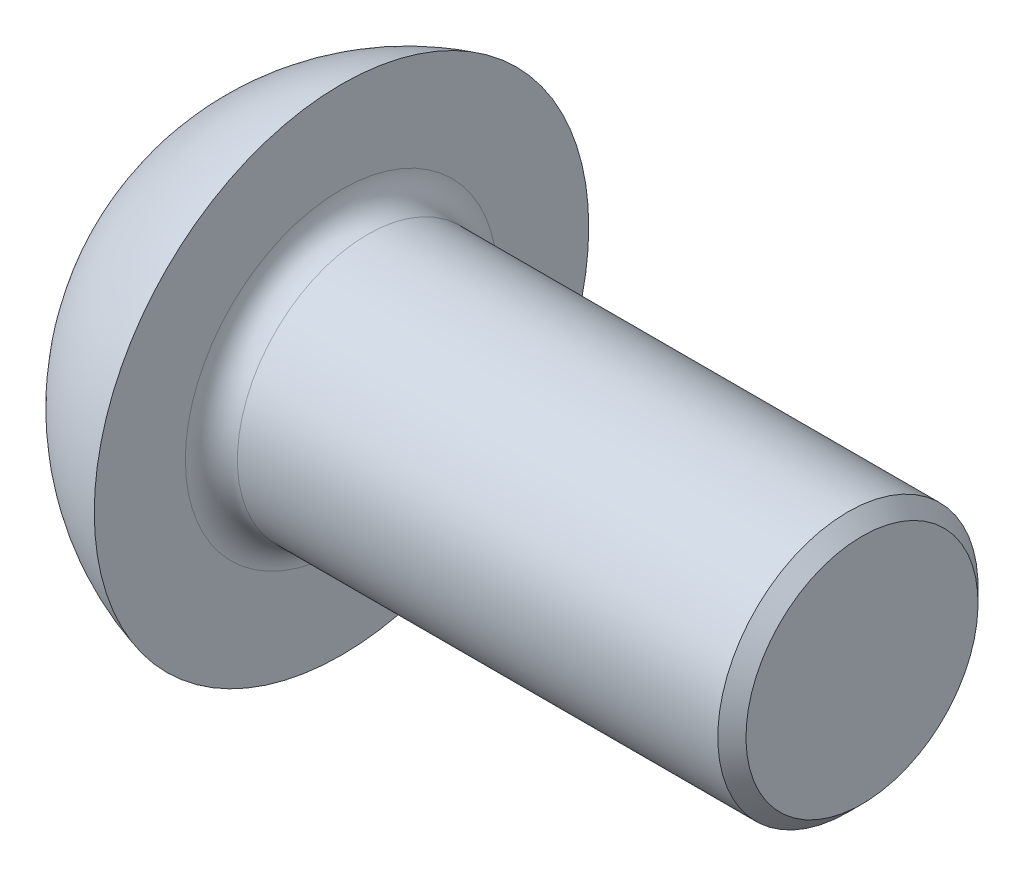
ISO-10303-21;
HEADER;
FILE_DESCRIPTION(('STEP AP214'),'2;1');
FILE_NAME('part.step','',(''),(''),'','','');
FILE_SCHEMA(('AUTOMOTIVE_DESIGN { 1 0 10303 214 1 1 1 1 }'));
ENDSEC;
DATA;
#1=APPLICATION_CONTEXT('core data for automotive mechanical design processes');
#2=APPLICATION_PROTOCOL_DEFINITION('international standard','automotive_design',2000,#1);
#3=PRODUCT_CONTEXT('',#1,'mechanical');
#4=PRODUCT('Part','Part','',(#3));
#5=PRODUCT_RELATED_PRODUCT_CATEGORY('part','',(#4));
#6=PRODUCT_DEFINITION_FORMATION('','',#4);
#7=PRODUCT_DEFINITION_CONTEXT('part definition',#1,'design');
#8=PRODUCT_DEFINITION('design','',#6,#7);
#9=PRODUCT_DEFINITION_SHAPE('','',#8);
#10=(LENGTH_UNIT() NAMED_UNIT(*) SI_UNIT(.MILLI.,.METRE.));
#11=(NAMED_UNIT(*) PLANE_ANGLE_UNIT() SI_UNIT($,.RADIAN.));
#12=(NAMED_UNIT(*) SI_UNIT($,.STERADIAN.) SOLID_ANGLE_UNIT());
#13=UNCERTAINTY_MEASURE_WITH_UNIT(LENGTH_MEASURE(1.E-05),#10,'distance_accuracy_value','');
#14=(GEOMETRIC_REPRESENTATION_CONTEXT(3) GLOBAL_UNCERTAINTY_ASSIGNED_CONTEXT((#13)) GLOBAL_UNIT_ASSIGNED_CONTEXT((#10,
#11,#12)) REPRESENTATION_CONTEXT('',''));
#15=CARTESIAN_POINT('',(0.,0.,0.));
#16=DIRECTION('',(0.,0.,1.));
#17=DIRECTION('',(1.,0.,0.));
#18=AXIS2_PLACEMENT_3D('',#15,#16,#17);
#19=CARTESIAN_POINT('',(-1.651,-0.500129670685513,-0.86625));
#20=DIRECTION('',(0.,-0.5,-0.866025403784439));
#21=DIRECTION('',(0.,0.866025403784439,-0.5));
#22=AXIS2_PLACEMENT_3D('',#19,#20,#21);
#23=PLANE('',#22);
#24=DIRECTION('',(0.,0.866025403784439,-0.5));
#25=VECTOR('',#24,1.);
#26=CARTESIAN_POINT('',(-1.65,-0.18193505277095,-1.04995974830766));
#27=LINE('',#26,#25);
#28=CARTESIAN_POINT('',(-1.65,-1.00025934137103,-0.5775));
#29=VERTEX_POINT('',#28);
#30=CARTESIAN_POINT('',(-1.65,0.,-1.155));
#31=VERTEX_POINT('',#30);
#32=EDGE_CURVE('E34',#29,#31,#27,.T.);
#33=ORIENTED_EDGE('',*,*,#32,.F.);
#34=DIRECTION('',(-1.,0.,0.));
#35=VECTOR('',#34,1.);
#36=CARTESIAN_POINT('',(-1.131,-1.00025934137103,-0.5775));
#37=LINE('',#36,#35);
#38=CARTESIAN_POINT('',(-0.611,-1.00025934137103,-0.5775));
#39=VERTEX_POINT('',#38);
#40=EDGE_CURVE('E101',#39,#29,#37,.T.);
#41=ORIENTED_EDGE('',*,*,#40,.F.);
#42=CARTESIAN_POINT('',(-0.611,0.,-1.155));
#43=CARTESIAN_POINT('',(-0.444290109771495,-0.500129670685514,-0.866249999999999));
#44=CARTESIAN_POINT('',(-0.611,-1.00025934137103,-0.5775));
#45=(BOUNDED_CURVE() B_SPLINE_CURVE(2,(#42,#43,#44),.UNSPECIFIED.,.F.,
.F.) B_SPLINE_CURVE_WITH_KNOTS((3,3),(0.,1.16873916190792),
.UNSPECIFIED.) CURVE() GEOMETRIC_REPRESENTATION_ITEM() RATIONAL_B_SPLINE_CURVE((1.,
1.15470053837925,1.)) REPRESENTATION_ITEM(''));
#46=CARTESIAN_POINT('',(-0.611,0.,-1.155));
#47=VERTEX_POINT('',#46);
#48=EDGE_CURVE('E150',#47,#39,#45,.T.);
#49=ORIENTED_EDGE('',*,*,#48,.F.);
#50=DIRECTION('',(-1.,0.,0.));
#51=VECTOR('',#50,1.);
#52=CARTESIAN_POINT('',(-1.131,0.,-1.155));
#53=LINE('',#52,#51);
#54=EDGE_CURVE('E11',#47,#31,#53,.T.);
#55=ORIENTED_EDGE('',*,*,#54,.T.);
#56=EDGE_LOOP('',(#33,#41,#49,#55));
#57=FACE_BOUND('',#56,.T.);
#58=ADVANCED_FACE('F16',(#57),#23,.F.);
#59=CARTESIAN_POINT('',(-1.651,0.500129670685513,-0.86625));
#60=DIRECTION('',(0.,0.5,-0.866025403784439));
#61=DIRECTION('',(0.,0.866025403784439,0.5));
#62=AXIS2_PLACEMENT_3D('',#59,#60,#61);
#63=PLANE('',#62);
#64=DIRECTION('',(0.,0.866025403784439,0.5));
#65=VECTOR('',#64,1.);
#66=CARTESIAN_POINT('',(-1.65,0.818324288600077,-0.682540251692337));
#67=LINE('',#66,#65);
#68=CARTESIAN_POINT('',(-1.65,1.00025934137103,-0.5775));
#69=VERTEX_POINT('',#68);
#70=EDGE_CURVE('E137',#31,#69,#67,.T.);
#71=ORIENTED_EDGE('',*,*,#70,.F.);
#72=ORIENTED_EDGE('',*,*,#54,.F.);
#73=CARTESIAN_POINT('',(-0.611,1.00025934137103,-0.5775));
#74=CARTESIAN_POINT('',(-0.444290109771496,0.500129670685513,-0.866250000000001));
#75=CARTESIAN_POINT('',(-0.611,0.,-1.155));
#76=(BOUNDED_CURVE() B_SPLINE_CURVE(2,(#73,#74,#75),.UNSPECIFIED.,.F.,
.F.) B_SPLINE_CURVE_WITH_KNOTS((3,3),(0.,1.16873916190792),
.UNSPECIFIED.) CURVE() GEOMETRIC_REPRESENTATION_ITEM() RATIONAL_B_SPLINE_CURVE((1.,
1.15470053837925,1.)) REPRESENTATION_ITEM(''));
#77=CARTESIAN_POINT('',(-0.611,1.00025934137103,-0.5775));
#78=VERTEX_POINT('',#77);
#79=EDGE_CURVE('E142',#78,#47,#76,.T.);
#80=ORIENTED_EDGE('',*,*,#79,.F.);
#81=DIRECTION('',(-1.,0.,0.));
#82=VECTOR('',#81,1.);
#83=CARTESIAN_POINT('',(-1.131,1.00025934137103,-0.5775));
#84=LINE('',#83,#82);
#85=EDGE_CURVE('E26',#78,#69,#84,.T.);
#86=ORIENTED_EDGE('',*,*,#85,.T.);
#87=EDGE_LOOP('',(#71,#72,#80,#86));
#88=FACE_BOUND('',#87,.T.);
#89=ADVANCED_FACE('F185',(#88),#63,.F.);
#90=CARTESIAN_POINT('',(-1.651,1.00025934137103,0.));
#91=DIRECTION('',(0.,1.,0.));
#92=DIRECTION('',(0.,0.,1.));
#93=AXIS2_PLACEMENT_3D('',#90,#91,#92);
#94=PLANE('',#93);
#95=DIRECTION('',(0.,0.,1.));
#96=VECTOR('',#95,1.);
#97=CARTESIAN_POINT('',(-1.65,1.00025934137103,0.));
#98=LINE('',#97,#96);
#99=CARTESIAN_POINT('',(-1.65,1.00025934137103,0.5775));
#100=VERTEX_POINT('',#99);
#101=EDGE_CURVE('E155',#69,#100,#98,.T.);
#102=ORIENTED_EDGE('',*,*,#101,.F.);
#103=ORIENTED_EDGE('',*,*,#85,.F.);
#104=CARTESIAN_POINT('',(-0.611,1.00025934137103,0.5775));
#105=CARTESIAN_POINT('',(-0.444290109771495,1.00025934137103,0.));
#106=CARTESIAN_POINT('',(-0.611,1.00025934137103,-0.5775));
#107=(BOUNDED_CURVE() B_SPLINE_CURVE(2,(#104,#105,#106),.UNSPECIFIED.,.F.,
.F.) B_SPLINE_CURVE_WITH_KNOTS((3,3),(0.,1.16873916190793),
.UNSPECIFIED.) CURVE() GEOMETRIC_REPRESENTATION_ITEM() RATIONAL_B_SPLINE_CURVE((1.,
1.15470053837925,1.)) REPRESENTATION_ITEM(''));
#108=CARTESIAN_POINT('',(-0.611,1.00025934137103,0.5775));
#109=VERTEX_POINT('',#108);
#110=EDGE_CURVE('E126',#109,#78,#107,.T.);
#111=ORIENTED_EDGE('',*,*,#110,.F.);
#112=DIRECTION('',(-1.,0.,0.));
#113=VECTOR('',#112,1.);
#114=CARTESIAN_POINT('',(-1.131,1.00025934137103,0.5775));
#115=LINE('',#114,#113);
#116=EDGE_CURVE('E103',#109,#100,#115,.T.);
#117=ORIENTED_EDGE('',*,*,#116,.T.);
#118=EDGE_LOOP('',(#102,#103,#111,#117));
#119=FACE_BOUND('',#118,.T.);
#120=ADVANCED_FACE('F190',(#119),#94,.F.);
#121=CARTESIAN_POINT('',(-1.651,-1.00025934137103,0.));
#122=DIRECTION('',(0.,-1.,0.));
#123=DIRECTION('',(0.,0.,-1.));
#124=AXIS2_PLACEMENT_3D('',#121,#122,#123);
#125=PLANE('',#124);
#126=DIRECTION('',(0.,0.,-1.));
#127=VECTOR('',#126,1.);
#128=CARTESIAN_POINT('',(-1.65,-1.00025934137103,0.));
#129=LINE('',#128,#127);
#130=CARTESIAN_POINT('',(-1.65,-1.00025934137103,0.5775));
#131=VERTEX_POINT('',#130);
#132=EDGE_CURVE('E136',#131,#29,#129,.T.);
#133=ORIENTED_EDGE('',*,*,#132,.F.);
#134=DIRECTION('',(-1.,0.,0.));
#135=VECTOR('',#134,1.);
#136=CARTESIAN_POINT('',(-1.131,-1.00025934137103,0.5775));
#137=LINE('',#136,#135);
#138=CARTESIAN_POINT('',(-0.611,-1.00025934137103,0.5775));
#139=VERTEX_POINT('',#138);
#140=EDGE_CURVE('E108',#139,#131,#137,.T.);
#141=ORIENTED_EDGE('',*,*,#140,.F.);
#142=CARTESIAN_POINT('',(-0.611,-1.00025934137103,-0.5775));
#143=CARTESIAN_POINT('',(-0.444290109771495,-1.00025934137103,0.));
#144=CARTESIAN_POINT('',(-0.611,-1.00025934137103,0.5775));
#145=(BOUNDED_CURVE() B_SPLINE_CURVE(2,(#142,#143,#144),.UNSPECIFIED.,.F.,
.F.) B_SPLINE_CURVE_WITH_KNOTS((3,3),(0.,1.16873916190792),
.UNSPECIFIED.) CURVE() GEOMETRIC_REPRESENTATION_ITEM() RATIONAL_B_SPLINE_CURVE((1.,
1.15470053837925,1.)) REPRESENTATION_ITEM(''));
#146=EDGE_CURVE('E110',#39,#139,#145,.T.);
#147=ORIENTED_EDGE('',*,*,#146,.F.);
#148=ORIENTED_EDGE('',*,*,#40,.T.);
#149=EDGE_LOOP('',(#133,#141,#147,#148));
#150=FACE_BOUND('',#149,.T.);
#151=ADVANCED_FACE('F18',(#150),#125,.F.);
#152=CARTESIAN_POINT('',(-1.651,0.500129670685513,0.86625));
#153=DIRECTION('',(0.,0.5,0.866025403784439));
#154=DIRECTION('',(0.,-0.866025403784439,0.5));
#155=AXIS2_PLACEMENT_3D('',#152,#153,#154);
#156=PLANE('',#155);
#157=DIRECTION('',(0.,-0.866025403784439,0.5));
#158=VECTOR('',#157,1.);
#159=CARTESIAN_POINT('',(-1.65,0.818324288600077,0.682540251692336));
#160=LINE('',#159,#158);
#161=CARTESIAN_POINT('',(-1.65,0.,1.155));
#162=VERTEX_POINT('',#161);
#163=EDGE_CURVE('E64',#100,#162,#160,.T.);
#164=ORIENTED_EDGE('',*,*,#163,.F.);
#165=ORIENTED_EDGE('',*,*,#116,.F.);
#166=CARTESIAN_POINT('',(-0.611,0.,1.155));
#167=CARTESIAN_POINT('',(-0.444290109771496,0.500129670685514,0.866249999999999));
#168=CARTESIAN_POINT('',(-0.611,1.00025934137103,0.5775));
#169=(BOUNDED_CURVE() B_SPLINE_CURVE(2,(#166,#167,#168),.UNSPECIFIED.,.F.,
.F.) B_SPLINE_CURVE_WITH_KNOTS((3,3),(0.,1.16873916190792),
.UNSPECIFIED.) CURVE() GEOMETRIC_REPRESENTATION_ITEM() RATIONAL_B_SPLINE_CURVE((1.,
1.15470053837925,1.)) REPRESENTATION_ITEM(''));
#170=CARTESIAN_POINT('',(-0.611,0.,1.155));
#171=VERTEX_POINT('',#170);
#172=EDGE_CURVE('E122',#171,#109,#169,.T.);
#173=ORIENTED_EDGE('',*,*,#172,.F.);
#174=DIRECTION('',(1.,0.,0.));
#175=VECTOR('',#174,1.);
#176=CARTESIAN_POINT('',(-1.131,0.,1.155));
#177=LINE('',#176,#175);
#178=EDGE_CURVE('E98',#162,#171,#177,.T.);
#179=ORIENTED_EDGE('',*,*,#178,.F.);
#180=EDGE_LOOP('',(#164,#165,#173,#179));
#181=FACE_BOUND('',#180,.T.);
#182=ADVANCED_FACE('F215',(#181),#156,.F.);
#183=CARTESIAN_POINT('',(-1.651,-0.500129670685513,0.86625));
#184=DIRECTION('',(0.,-0.5,0.866025403784439));
#185=DIRECTION('',(0.,-0.866025403784439,-0.5));
#186=AXIS2_PLACEMENT_3D('',#183,#184,#185);
#187=PLANE('',#186);
#188=DIRECTION('',(0.,-0.866025403784439,-0.5));
#189=VECTOR('',#188,1.);
#190=CARTESIAN_POINT('',(-1.65,-0.18193505277095,1.04995974830766));
#191=LINE('',#190,#189);
#192=EDGE_CURVE('E20',#162,#131,#191,.T.);
#193=ORIENTED_EDGE('',*,*,#192,.F.);
#194=ORIENTED_EDGE('',*,*,#178,.T.);
#195=CARTESIAN_POINT('',(-0.611,-1.00025934137103,0.5775));
#196=CARTESIAN_POINT('',(-0.444290109771496,-0.500129670685513,0.866250000000001));
#197=CARTESIAN_POINT('',(-0.611,0.,1.155));
#198=(BOUNDED_CURVE() B_SPLINE_CURVE(2,(#195,#196,#197),.UNSPECIFIED.,.F.,
.F.) B_SPLINE_CURVE_WITH_KNOTS((3,3),(0.,1.16873916190792),
.UNSPECIFIED.) CURVE() GEOMETRIC_REPRESENTATION_ITEM() RATIONAL_B_SPLINE_CURVE((1.,
1.15470053837925,1.)) REPRESENTATION_ITEM(''));
#199=EDGE_CURVE('E114',#139,#171,#198,.T.);
#200=ORIENTED_EDGE('',*,*,#199,.F.);
#201=ORIENTED_EDGE('',*,*,#140,.T.);
#202=EDGE_LOOP('',(#193,#194,#200,#201));
#203=FACE_BOUND('',#202,.T.);
#204=ADVANCED_FACE('F213',(#203),#187,.F.);
#205=CARTESIAN_POINT('',(-0.277580219542991,0.,0.));
#206=DIRECTION('',(-1.,0.,0.));
#207=DIRECTION('',(0.,1.,0.));
#208=AXIS2_PLACEMENT_3D('',#205,#206,#207);
#209=CONICAL_SURFACE('',#208,0.5775,1.0471975511966);
#210=ORIENTED_EDGE('',*,*,#146,.T.);
#211=ORIENTED_EDGE('',*,*,#199,.T.);
#212=ORIENTED_EDGE('',*,*,#172,.T.);
#213=ORIENTED_EDGE('',*,*,#110,.T.);
#214=ORIENTED_EDGE('',*,*,#79,.T.);
#215=ORIENTED_EDGE('',*,*,#48,.T.);
#216=EDGE_LOOP('',(#210,#211,#212,#213,#214,#215));
#217=FACE_BOUND('',#216,.T.);
#218=CARTESIAN_POINT('',(0.0558395609140181,0.,0.));
#219=VERTEX_POINT('',#218);
#220=VERTEX_LOOP('',#219);
#221=FACE_BOUND('',#220,.T.);
#222=ADVANCED_FACE('F211',(#217,#221),#209,.F.);
#223=CARTESIAN_POINT('',(0.3,0.,0.));
#224=DIRECTION('',(1.,0.,0.));
#225=DIRECTION('',(0.,0.,-1.));
#226=AXIS2_PLACEMENT_3D('',#223,#224,#225);
#227=TOROIDAL_SURFACE('',#226,1.8,0.3);
#228=CARTESIAN_POINT('',(0.3,0.,0.));
#229=DIRECTION('',(1.,0.,0.));
#230=DIRECTION('',(0.,1.,0.));
#231=AXIS2_PLACEMENT_3D('',#228,#229,#230);
#232=CIRCLE('',#231,1.5);
#233=CARTESIAN_POINT('',(0.3,1.5,0.));
#234=VERTEX_POINT('',#233);
#235=EDGE_CURVE('E77',#234,#234,#232,.T.);
#236=ORIENTED_EDGE('',*,*,#235,.F.);
#237=EDGE_LOOP('',(#236));
#238=FACE_BOUND('',#237,.T.);
#239=CARTESIAN_POINT('',(0.,0.,0.));
#240=DIRECTION('',(1.,0.,0.));
#241=DIRECTION('',(0.,1.,0.));
#242=AXIS2_PLACEMENT_3D('',#239,#240,#241);
#243=CIRCLE('',#242,1.8);
#244=CARTESIAN_POINT('',(0.,1.8,0.));
#245=VERTEX_POINT('',#244);
#246=EDGE_CURVE('E92',#245,#245,#243,.T.);
#247=ORIENTED_EDGE('',*,*,#246,.T.);
#248=EDGE_LOOP('',(#247));
#249=FACE_BOUND('',#248,.T.);
#250=ADVANCED_FACE('F170',(#238,#249),#227,.F.);
#251=CARTESIAN_POINT('',(3.0688125,0.,0.));
#252=DIRECTION('',(-1.,0.,0.));
#253=DIRECTION('',(0.,1.,0.));
#254=AXIS2_PLACEMENT_3D('',#251,#252,#253);
#255=CYLINDRICAL_SURFACE('',#254,1.5);
#256=CARTESIAN_POINT('',(5.837625,0.,0.));
#257=DIRECTION('',(1.,0.,0.));
#258=DIRECTION('',(0.,1.,0.));
#259=AXIS2_PLACEMENT_3D('',#256,#257,#258);
#260=CIRCLE('',#259,1.5);
#261=CARTESIAN_POINT('',(5.837625,1.5,0.));
#262=VERTEX_POINT('',#261);
#263=EDGE_CURVE('E86',#262,#262,#260,.T.);
#264=ORIENTED_EDGE('',*,*,#263,.F.);
#265=EDGE_LOOP('',(#264));
#266=FACE_BOUND('',#265,.T.);
#267=ORIENTED_EDGE('',*,*,#235,.T.);
#268=EDGE_LOOP('',(#267));
#269=FACE_BOUND('',#268,.T.);
#270=ADVANCED_FACE('F87',(#266,#269),#255,.T.);
#271=CARTESIAN_POINT('',(5.9188125,0.,0.));
#272=DIRECTION('',(-1.,0.,0.));
#273=DIRECTION('',(0.,1.,0.));
#274=AXIS2_PLACEMENT_3D('',#271,#272,#273);
#275=CONICAL_SURFACE('',#274,1.4188125,0.785398163397448);
#276=CARTESIAN_POINT('',(6.,0.,0.));
#277=DIRECTION('',(1.,0.,0.));
#278=DIRECTION('',(0.,1.,0.));
#279=AXIS2_PLACEMENT_3D('',#276,#277,#278);
#280=CIRCLE('',#279,1.337625);
#281=CARTESIAN_POINT('',(6.,1.337625,0.));
#282=VERTEX_POINT('',#281);
#283=EDGE_CURVE('E90',#282,#282,#280,.T.);
#284=ORIENTED_EDGE('',*,*,#283,.F.);
#285=EDGE_LOOP('',(#284));
#286=FACE_BOUND('',#285,.T.);
#287=ORIENTED_EDGE('',*,*,#263,.T.);
#288=EDGE_LOOP('',(#287));
#289=FACE_BOUND('',#288,.T.);
#290=ADVANCED_FACE('F197',(#286,#289),#275,.T.);
#291=CARTESIAN_POINT('',(6.,0.6688125,0.));
#292=DIRECTION('',(1.,0.,0.));
#293=DIRECTION('',(0.,1.,0.));
#294=AXIS2_PLACEMENT_3D('',#291,#292,#293);
#295=PLANE('',#294);
#296=ORIENTED_EDGE('',*,*,#283,.T.);
#297=EDGE_LOOP('',(#296));
#298=FACE_BOUND('',#297,.T.);
#299=ADVANCED_FACE('F199',(#298),#295,.T.);
#300=CARTESIAN_POINT('',(-1.65,0.848518981105504,0.));
#301=DIRECTION('',(-1.,0.,0.));
#302=DIRECTION('',(0.,-1.,0.));
#303=AXIS2_PLACEMENT_3D('',#300,#301,#302);
#304=PLANE('',#303);
#305=ORIENTED_EDGE('',*,*,#163,.T.);
#306=ORIENTED_EDGE('',*,*,#192,.T.);
#307=ORIENTED_EDGE('',*,*,#132,.T.);
#308=ORIENTED_EDGE('',*,*,#32,.T.);
#309=ORIENTED_EDGE('',*,*,#70,.T.);
#310=ORIENTED_EDGE('',*,*,#101,.T.);
#311=EDGE_LOOP('',(#305,#306,#307,#308,#309,#310));
#312=FACE_BOUND('',#311,.T.);
#313=CARTESIAN_POINT('',(-1.65,0.,0.));
#314=DIRECTION('',(1.,0.,0.));
#315=DIRECTION('',(0.,1.,0.));
#316=AXIS2_PLACEMENT_3D('',#313,#314,#315);
#317=CIRCLE('',#316,1.69703796221101);
#318=CARTESIAN_POINT('',(-1.65,1.69703796221101,0.));
#319=VERTEX_POINT('',#318);
#320=EDGE_CURVE('E52',#319,#319,#317,.T.);
#321=ORIENTED_EDGE('',*,*,#320,.F.);
#322=EDGE_LOOP('',(#321));
#323=FACE_BOUND('',#322,.T.);
#324=ADVANCED_FACE('F181',(#312,#323),#304,.T.);
#325=CARTESIAN_POINT('',(0.7636551984287,0.,0.));
#326=DIRECTION('',(0.,0.,1.));
#327=DIRECTION('',(1.,0.,0.));
#328=AXIS2_PLACEMENT_3D('',#325,#326,#327);
#329=SPHERICAL_SURFACE('',#328,2.95053711416873);
#330=CARTESIAN_POINT('',(0.7636551984287,0.,0.));
#331=DIRECTION('',(1.,0.,0.));
#332=DIRECTION('',(0.,1.,0.));
#333=AXIS2_PLACEMENT_3D('',#330,#331,#332);
#334=SPHERICAL_SURFACE('',#333,2.95053711416873);
#335=CARTESIAN_POINT('',(0.,0.,0.));
#336=DIRECTION('',(1.,0.,0.));
#337=DIRECTION('',(0.,1.,0.));
#338=AXIS2_PLACEMENT_3D('',#335,#336,#337);
#339=CIRCLE('',#338,2.85);
#340=CARTESIAN_POINT('',(0.,2.85,0.));
#341=VERTEX_POINT('',#340);
#342=EDGE_CURVE('E47',#341,#341,#339,.T.);
#343=ORIENTED_EDGE('',*,*,#342,.F.);
#344=EDGE_LOOP('',(#343));
#345=FACE_BOUND('',#344,.T.);
#346=ORIENTED_EDGE('',*,*,#320,.T.);
#347=EDGE_LOOP('',(#346));
#348=FACE_BOUND('',#347,.T.);
#349=ADVANCED_FACE('F175',(#345,#348),#334,.T.);
#350=CARTESIAN_POINT('',(0.,2.325,0.));
#351=DIRECTION('',(1.,0.,0.));
#352=DIRECTION('',(0.,1.,0.));
#353=AXIS2_PLACEMENT_3D('',#350,#351,#352);
#354=PLANE('',#353);
#355=ORIENTED_EDGE('',*,*,#246,.F.);
#356=EDGE_LOOP('',(#355));
#357=FACE_BOUND('',#356,.T.);
#358=ORIENTED_EDGE('',*,*,#342,.T.);
#359=EDGE_LOOP('',(#358));
#360=FACE_BOUND('',#359,.T.);
#361=ADVANCED_FACE('F172',(#357,#360),#354,.T.);
#362=CLOSED_SHELL('',(#58,#89,#120,#151,#182,#204,#222,#250,#270,#290,#299,#324,#349,#361));
#363=MANIFOLD_SOLID_BREP('B1',#362);
#364=ADVANCED_BREP_SHAPE_REPRESENTATION('',(#18,#363),#14);
#365=SHAPE_DEFINITION_REPRESENTATION(#9,#364);
ENDSEC;
END-ISO-10303-21;
